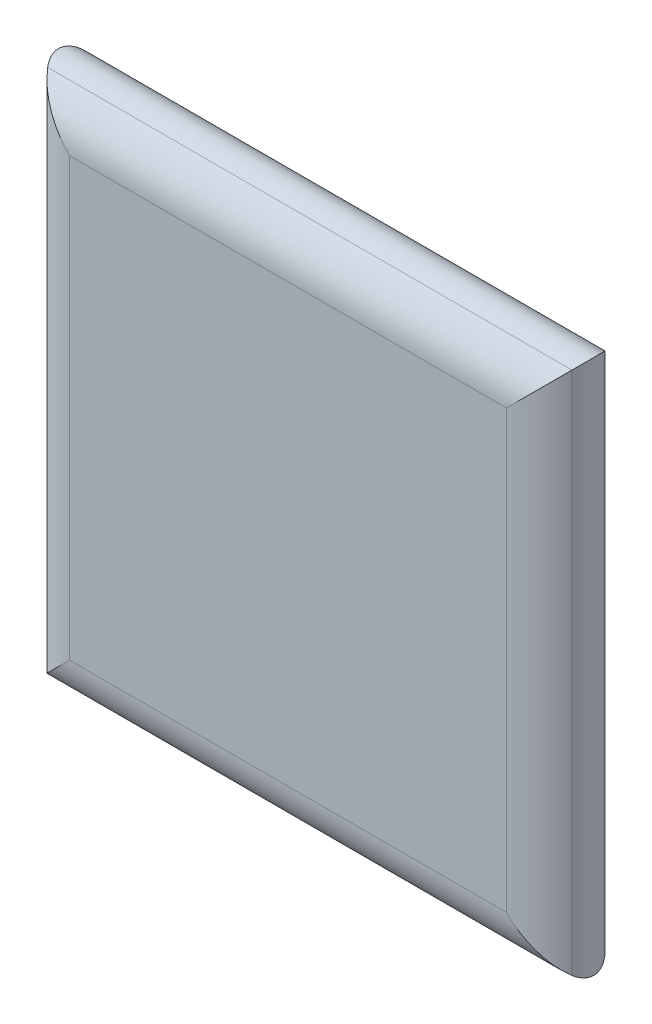
ISO-10303-21;
HEADER;
FILE_DESCRIPTION(('STEP AP214'),'2;1');
FILE_NAME('part.step','',(''),(''),'','','');
FILE_SCHEMA(('AUTOMOTIVE_DESIGN { 1 0 10303 214 1 1 1 1 }'));
ENDSEC;
DATA;
#1=APPLICATION_CONTEXT('core data for automotive mechanical design processes');
#2=APPLICATION_PROTOCOL_DEFINITION('international standard','automotive_design',2000,#1);
#3=PRODUCT_CONTEXT('',#1,'mechanical');
#4=PRODUCT('Part','Part','',(#3));
#5=PRODUCT_RELATED_PRODUCT_CATEGORY('part','',(#4));
#6=PRODUCT_DEFINITION_FORMATION('','',#4);
#7=PRODUCT_DEFINITION_CONTEXT('part definition',#1,'design');
#8=PRODUCT_DEFINITION('design','',#6,#7);
#9=PRODUCT_DEFINITION_SHAPE('','',#8);
#10=(LENGTH_UNIT() NAMED_UNIT(*) SI_UNIT(.MILLI.,.METRE.));
#11=(NAMED_UNIT(*) PLANE_ANGLE_UNIT() SI_UNIT($,.RADIAN.));
#12=(NAMED_UNIT(*) SI_UNIT($,.STERADIAN.) SOLID_ANGLE_UNIT());
#13=UNCERTAINTY_MEASURE_WITH_UNIT(LENGTH_MEASURE(1.E-05),#10,'distance_accuracy_value','');
#14=(GEOMETRIC_REPRESENTATION_CONTEXT(3) GLOBAL_UNCERTAINTY_ASSIGNED_CONTEXT((#13)) GLOBAL_UNIT_ASSIGNED_CONTEXT((#10,
#11,#12)) REPRESENTATION_CONTEXT('',''));
#15=CARTESIAN_POINT('',(0.,0.,0.));
#16=DIRECTION('',(0.,0.,1.));
#17=DIRECTION('',(1.,0.,0.));
#18=AXIS2_PLACEMENT_3D('',#15,#16,#17);
#19=CARTESIAN_POINT('',(0.,0.,60.));
#20=DIRECTION('',(0.,0.,1.));
#21=DIRECTION('',(1.,0.,0.));
#22=AXIS2_PLACEMENT_3D('',#19,#20,#21);
#23=PLANE('',#22);
#24=DIRECTION('',(1.,0.,0.));
#25=VECTOR('',#24,1.);
#26=CARTESIAN_POINT('',(261.616161616162,-183.333333333333,60.));
#27=LINE('',#26,#25);
#28=CARTESIAN_POINT('',(-188.383838383838,-183.333333333333,60.));
#29=VERTEX_POINT('',#28);
#30=CARTESIAN_POINT('',(211.616161616162,-183.333333333333,60.));
#31=VERTEX_POINT('',#30);
#32=EDGE_CURVE('E115',#29,#31,#27,.T.);
#33=ORIENTED_EDGE('',*,*,#32,.T.);
#34=DIRECTION('',(0.,1.,0.));
#35=VECTOR('',#34,1.);
#36=CARTESIAN_POINT('',(211.616161616162,266.666666666667,60.));
#37=LINE('',#36,#35);
#38=CARTESIAN_POINT('',(211.616161616162,216.666666666667,60.));
#39=VERTEX_POINT('',#38);
#40=EDGE_CURVE('E97',#31,#39,#37,.T.);
#41=ORIENTED_EDGE('',*,*,#40,.T.);
#42=DIRECTION('',(-1.,0.,0.));
#43=VECTOR('',#42,1.);
#44=CARTESIAN_POINT('',(-238.383838383838,216.666666666667,60.));
#45=LINE('',#44,#43);
#46=CARTESIAN_POINT('',(-188.383838383838,216.666666666667,60.));
#47=VERTEX_POINT('',#46);
#48=EDGE_CURVE('E104',#39,#47,#45,.T.);
#49=ORIENTED_EDGE('',*,*,#48,.T.);
#50=DIRECTION('',(0.,-1.,0.));
#51=VECTOR('',#50,1.);
#52=CARTESIAN_POINT('',(-188.383838383838,-233.333333333333,60.));
#53=LINE('',#52,#51);
#54=EDGE_CURVE('E111',#47,#29,#53,.T.);
#55=ORIENTED_EDGE('',*,*,#54,.T.);
#56=EDGE_LOOP('',(#33,#41,#49,#55));
#57=FACE_BOUND('',#56,.T.);
#58=ADVANCED_FACE('F39',(#57),#23,.T.);
#59=CARTESIAN_POINT('',(0.,0.,0.));
#60=DIRECTION('',(0.,0.,1.));
#61=DIRECTION('',(1.,0.,0.));
#62=AXIS2_PLACEMENT_3D('',#59,#60,#61);
#63=PLANE('',#62);
#64=DIRECTION('',(1.,0.,0.));
#65=VECTOR('',#64,1.);
#66=CARTESIAN_POINT('',(0.,-203.333333333333,0.));
#67=LINE('',#66,#65);
#68=CARTESIAN_POINT('',(231.616161616162,-203.333333333333,0.));
#69=VERTEX_POINT('',#68);
#70=CARTESIAN_POINT('',(-208.383838383838,-203.333333333333,0.));
#71=VERTEX_POINT('',#70);
#72=EDGE_CURVE('E134',#69,#71,#67,.F.);
#73=ORIENTED_EDGE('',*,*,#72,.T.);
#74=DIRECTION('',(0.,-1.,0.));
#75=VECTOR('',#74,1.);
#76=CARTESIAN_POINT('',(-208.383838383838,0.,0.));
#77=LINE('',#76,#75);
#78=CARTESIAN_POINT('',(-208.383838383838,236.666666666667,0.));
#79=VERTEX_POINT('',#78);
#80=EDGE_CURVE('E137',#71,#79,#77,.F.);
#81=ORIENTED_EDGE('',*,*,#80,.T.);
#82=DIRECTION('',(-1.,0.,0.));
#83=VECTOR('',#82,1.);
#84=CARTESIAN_POINT('',(0.,236.666666666667,0.));
#85=LINE('',#84,#83);
#86=CARTESIAN_POINT('',(231.616161616162,236.666666666667,0.));
#87=VERTEX_POINT('',#86);
#88=EDGE_CURVE('E117',#79,#87,#85,.F.);
#89=ORIENTED_EDGE('',*,*,#88,.T.);
#90=DIRECTION('',(0.,1.,0.));
#91=VECTOR('',#90,1.);
#92=CARTESIAN_POINT('',(231.616161616162,0.,0.));
#93=LINE('',#92,#91);
#94=EDGE_CURVE('E121',#87,#69,#93,.F.);
#95=ORIENTED_EDGE('',*,*,#94,.T.);
#96=EDGE_LOOP('',(#73,#81,#89,#95));
#97=FACE_BOUND('',#96,.T.);
#98=ADVANCED_FACE('F179',(#97),#63,.F.);
#99=CARTESIAN_POINT('',(-188.383838383838,0.,9.99999999999999));
#100=DIRECTION('',(0.,1.,0.));
#101=DIRECTION('',(0.,0.,1.));
#102=AXIS2_PLACEMENT_3D('',#99,#100,#101);
#103=CYLINDRICAL_SURFACE('',#102,50.);
#104=CARTESIAN_POINT('',(-188.383838383838,216.666666666667,9.99999999999999));
#105=DIRECTION('',(0.707106781186547,0.707106781186547,0.));
#106=DIRECTION('',(0.707106781186547,-0.707106781186547,0.));
#107=AXIS2_PLACEMENT_3D('',#104,#105,#106);
#108=ELLIPSE('',#107,70.7106781186548,50.);
#109=CARTESIAN_POINT('',(-228.383838383838,256.666666666667,40.));
#110=VERTEX_POINT('',#109);
#111=EDGE_CURVE('E107',#110,#47,#108,.T.);
#112=ORIENTED_EDGE('',*,*,#111,.F.);
#113=DIRECTION('',(0.,1.,0.));
#114=VECTOR('',#113,1.);
#115=CARTESIAN_POINT('',(-228.383838383838,0.,40.));
#116=LINE('',#115,#114);
#117=CARTESIAN_POINT('',(-228.383838383838,-223.333333333333,40.));
#118=VERTEX_POINT('',#117);
#119=EDGE_CURVE('E141',#110,#118,#116,.F.);
#120=ORIENTED_EDGE('',*,*,#119,.T.);
#121=CARTESIAN_POINT('',(-188.383838383838,-183.333333333333,9.99999999999999));
#122=DIRECTION('',(-0.707106781186547,0.707106781186547,0.));
#123=DIRECTION('',(0.707106781186547,0.707106781186547,0.));
#124=AXIS2_PLACEMENT_3D('',#121,#122,#123);
#125=ELLIPSE('',#124,70.7106781186548,50.);
#126=EDGE_CURVE('E112',#29,#118,#125,.F.);
#127=ORIENTED_EDGE('',*,*,#126,.F.);
#128=ORIENTED_EDGE('',*,*,#54,.F.);
#129=EDGE_LOOP('',(#112,#120,#127,#128));
#130=FACE_BOUND('',#129,.T.);
#131=ADVANCED_FACE('F173',(#130),#103,.T.);
#132=CARTESIAN_POINT('',(0.,-183.333333333333,9.99999999999999));
#133=DIRECTION('',(-1.,0.,0.));
#134=DIRECTION('',(0.,0.,1.));
#135=AXIS2_PLACEMENT_3D('',#132,#133,#134);
#136=CYLINDRICAL_SURFACE('',#135,50.);
#137=ORIENTED_EDGE('',*,*,#126,.T.);
#138=DIRECTION('',(-1.,0.,0.));
#139=VECTOR('',#138,1.);
#140=CARTESIAN_POINT('',(0.,-223.333333333333,40.));
#141=LINE('',#140,#139);
#142=CARTESIAN_POINT('',(251.616161616162,-223.333333333333,40.));
#143=VERTEX_POINT('',#142);
#144=EDGE_CURVE('E64',#118,#143,#141,.F.);
#145=ORIENTED_EDGE('',*,*,#144,.T.);
#146=CARTESIAN_POINT('',(211.616161616162,-183.333333333333,9.99999999999999));
#147=DIRECTION('',(-0.707106781186547,-0.707106781186547,0.));
#148=DIRECTION('',(-0.707106781186547,0.707106781186547,0.));
#149=AXIS2_PLACEMENT_3D('',#146,#147,#148);
#150=ELLIPSE('',#149,70.7106781186548,50.);
#151=EDGE_CURVE('E101',#31,#143,#150,.F.);
#152=ORIENTED_EDGE('',*,*,#151,.F.);
#153=ORIENTED_EDGE('',*,*,#32,.F.);
#154=EDGE_LOOP('',(#137,#145,#152,#153));
#155=FACE_BOUND('',#154,.T.);
#156=ADVANCED_FACE('F186',(#155),#136,.T.);
#157=CARTESIAN_POINT('',(0.,216.666666666667,9.99999999999999));
#158=DIRECTION('',(1.,0.,0.));
#159=DIRECTION('',(0.,0.,-1.));
#160=AXIS2_PLACEMENT_3D('',#157,#158,#159);
#161=CYLINDRICAL_SURFACE('',#160,50.);
#162=CARTESIAN_POINT('',(211.616161616162,216.666666666667,9.99999999999999));
#163=DIRECTION('',(0.707106781186547,-0.707106781186547,0.));
#164=DIRECTION('',(0.707106781186547,0.707106781186547,0.));
#165=AXIS2_PLACEMENT_3D('',#162,#163,#164);
#166=ELLIPSE('',#165,70.7106781186548,50.);
#167=CARTESIAN_POINT('',(251.616161616162,256.666666666667,40.));
#168=VERTEX_POINT('',#167);
#169=EDGE_CURVE('E93',#168,#39,#166,.T.);
#170=ORIENTED_EDGE('',*,*,#169,.F.);
#171=DIRECTION('',(1.,0.,0.));
#172=VECTOR('',#171,1.);
#173=CARTESIAN_POINT('',(0.,256.666666666667,40.));
#174=LINE('',#173,#172);
#175=EDGE_CURVE('E11',#168,#110,#174,.F.);
#176=ORIENTED_EDGE('',*,*,#175,.T.);
#177=ORIENTED_EDGE('',*,*,#111,.T.);
#178=ORIENTED_EDGE('',*,*,#48,.F.);
#179=EDGE_LOOP('',(#170,#176,#177,#178));
#180=FACE_BOUND('',#179,.T.);
#181=ADVANCED_FACE('F105',(#180),#161,.T.);
#182=CARTESIAN_POINT('',(211.616161616162,0.,9.99999999999999));
#183=DIRECTION('',(0.,-1.,0.));
#184=DIRECTION('',(0.,0.,-1.));
#185=AXIS2_PLACEMENT_3D('',#182,#183,#184);
#186=CYLINDRICAL_SURFACE('',#185,50.);
#187=ORIENTED_EDGE('',*,*,#151,.T.);
#188=DIRECTION('',(0.,-1.,0.));
#189=VECTOR('',#188,1.);
#190=CARTESIAN_POINT('',(251.616161616162,0.,40.));
#191=LINE('',#190,#189);
#192=EDGE_CURVE('E49',#143,#168,#191,.F.);
#193=ORIENTED_EDGE('',*,*,#192,.T.);
#194=ORIENTED_EDGE('',*,*,#169,.T.);
#195=ORIENTED_EDGE('',*,*,#40,.F.);
#196=EDGE_LOOP('',(#187,#193,#194,#195));
#197=FACE_BOUND('',#196,.T.);
#198=ADVANCED_FACE('F95',(#197),#186,.T.);
#199=CARTESIAN_POINT('',(231.616161616162,0.,25.));
#200=DIRECTION('',(0.,-1.,0.));
#201=DIRECTION('',(0.,0.,-1.));
#202=AXIS2_PLACEMENT_3D('',#199,#200,#201);
#203=CYLINDRICAL_SURFACE('',#202,25.);
#204=CARTESIAN_POINT('',(231.616161616162,236.666666666667,25.));
#205=DIRECTION('',(0.707106781186547,-0.707106781186547,0.));
#206=DIRECTION('',(0.707106781186547,0.707106781186547,0.));
#207=AXIS2_PLACEMENT_3D('',#204,#205,#206);
#208=ELLIPSE('',#207,35.3553390593274,25.);
#209=EDGE_CURVE('E154',#168,#87,#208,.F.);
#210=ORIENTED_EDGE('',*,*,#209,.F.);
#211=ORIENTED_EDGE('',*,*,#192,.F.);
#212=CARTESIAN_POINT('',(231.616161616162,-203.333333333333,25.));
#213=DIRECTION('',(-0.707106781186547,-0.707106781186547,0.));
#214=DIRECTION('',(0.707106781186547,-0.707106781186547,0.));
#215=AXIS2_PLACEMENT_3D('',#212,#213,#214);
#216=ELLIPSE('',#215,35.3553390593274,25.);
#217=EDGE_CURVE('E43',#69,#143,#216,.T.);
#218=ORIENTED_EDGE('',*,*,#217,.F.);
#219=ORIENTED_EDGE('',*,*,#94,.F.);
#220=EDGE_LOOP('',(#210,#211,#218,#219));
#221=FACE_BOUND('',#220,.T.);
#222=ADVANCED_FACE('F41',(#221),#203,.T.);
#223=CARTESIAN_POINT('',(0.,-203.333333333333,25.));
#224=DIRECTION('',(-1.,0.,0.));
#225=DIRECTION('',(0.,0.,1.));
#226=AXIS2_PLACEMENT_3D('',#223,#224,#225);
#227=CYLINDRICAL_SURFACE('',#226,25.);
#228=ORIENTED_EDGE('',*,*,#217,.T.);
#229=ORIENTED_EDGE('',*,*,#144,.F.);
#230=CARTESIAN_POINT('',(-208.383838383838,-203.333333333333,25.));
#231=DIRECTION('',(-0.707106781186547,0.707106781186547,0.));
#232=DIRECTION('',(-0.707106781186547,-0.707106781186547,0.));
#233=AXIS2_PLACEMENT_3D('',#230,#231,#232);
#234=ELLIPSE('',#233,35.3553390593274,25.);
#235=EDGE_CURVE('E152',#71,#118,#234,.T.);
#236=ORIENTED_EDGE('',*,*,#235,.F.);
#237=ORIENTED_EDGE('',*,*,#72,.F.);
#238=EDGE_LOOP('',(#228,#229,#236,#237));
#239=FACE_BOUND('',#238,.T.);
#240=ADVANCED_FACE('F165',(#239),#227,.T.);
#241=CARTESIAN_POINT('',(0.,236.666666666667,25.));
#242=DIRECTION('',(1.,0.,0.));
#243=DIRECTION('',(0.,0.,-1.));
#244=AXIS2_PLACEMENT_3D('',#241,#242,#243);
#245=CYLINDRICAL_SURFACE('',#244,25.);
#246=ORIENTED_EDGE('',*,*,#209,.T.);
#247=ORIENTED_EDGE('',*,*,#88,.F.);
#248=CARTESIAN_POINT('',(-208.383838383838,236.666666666667,25.));
#249=DIRECTION('',(0.707106781186547,0.707106781186547,0.));
#250=DIRECTION('',(0.707106781186547,-0.707106781186547,0.));
#251=AXIS2_PLACEMENT_3D('',#248,#249,#250);
#252=ELLIPSE('',#251,35.3553390593274,25.);
#253=EDGE_CURVE('E149',#110,#79,#252,.F.);
#254=ORIENTED_EDGE('',*,*,#253,.F.);
#255=ORIENTED_EDGE('',*,*,#175,.F.);
#256=EDGE_LOOP('',(#246,#247,#254,#255));
#257=FACE_BOUND('',#256,.T.);
#258=ADVANCED_FACE('F170',(#257),#245,.T.);
#259=CARTESIAN_POINT('',(-208.383838383838,0.,25.));
#260=DIRECTION('',(0.,1.,0.));
#261=DIRECTION('',(0.,0.,1.));
#262=AXIS2_PLACEMENT_3D('',#259,#260,#261);
#263=CYLINDRICAL_SURFACE('',#262,25.);
#264=ORIENTED_EDGE('',*,*,#235,.T.);
#265=ORIENTED_EDGE('',*,*,#119,.F.);
#266=ORIENTED_EDGE('',*,*,#253,.T.);
#267=ORIENTED_EDGE('',*,*,#80,.F.);
#268=EDGE_LOOP('',(#264,#265,#266,#267));
#269=FACE_BOUND('',#268,.T.);
#270=ADVANCED_FACE('F176',(#269),#263,.T.);
#271=CLOSED_SHELL('',(#58,#98,#131,#156,#181,#198,#222,#240,#258,#270));
#272=MANIFOLD_SOLID_BREP('B2',#271);
#273=ADVANCED_BREP_SHAPE_REPRESENTATION('',(#18,#272),#14);
#274=SHAPE_DEFINITION_REPRESENTATION(#9,#273);
ENDSEC;
END-ISO-10303-21;
